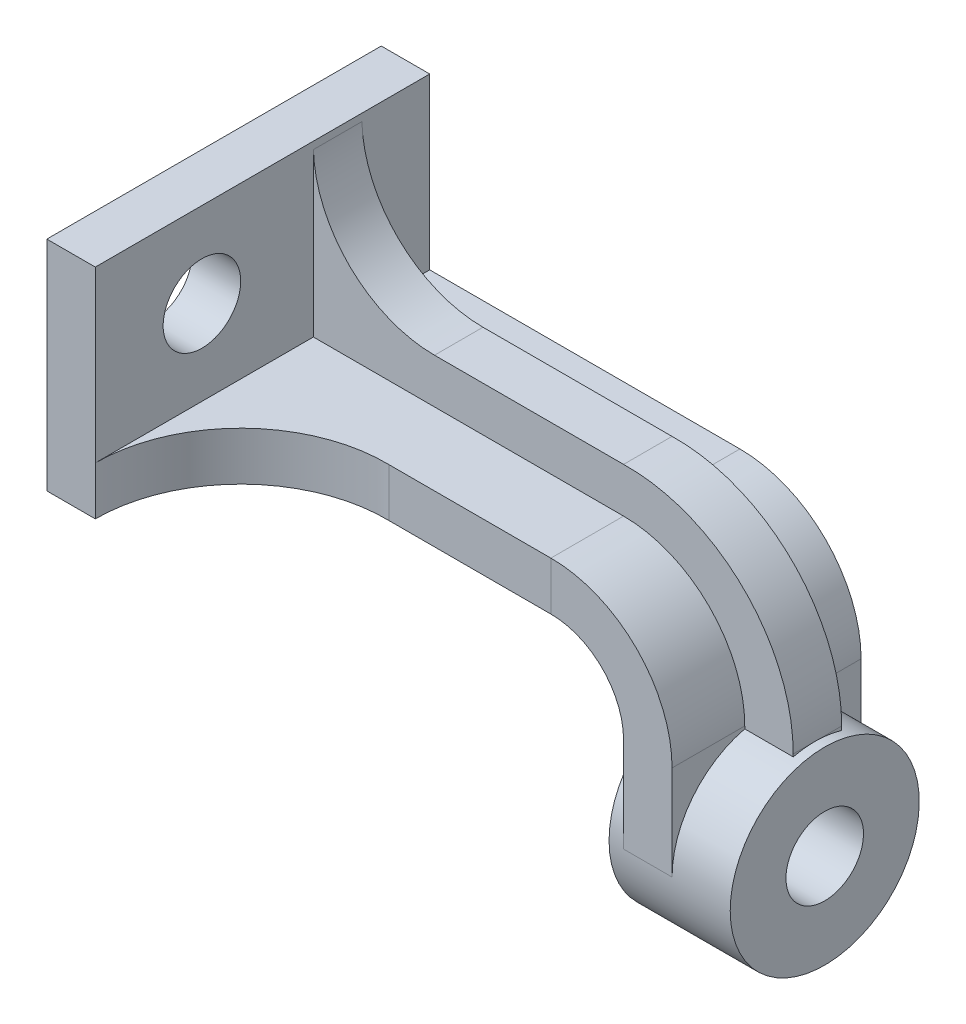
ISO-10303-21;
HEADER;
FILE_DESCRIPTION(('STEP AP214'),'2;1');
FILE_NAME('part.step','',(''),(''),'','','');
FILE_SCHEMA(('AUTOMOTIVE_DESIGN { 1 0 10303 214 1 1 1 1 }'));
ENDSEC;
DATA;
#1=APPLICATION_CONTEXT('core data for automotive mechanical design processes');
#2=APPLICATION_PROTOCOL_DEFINITION('international standard','automotive_design',2000,#1);
#3=PRODUCT_CONTEXT('',#1,'mechanical');
#4=PRODUCT('Part','Part','',(#3));
#5=PRODUCT_RELATED_PRODUCT_CATEGORY('part','',(#4));
#6=PRODUCT_DEFINITION_FORMATION('','',#4);
#7=PRODUCT_DEFINITION_CONTEXT('part definition',#1,'design');
#8=PRODUCT_DEFINITION('design','',#6,#7);
#9=PRODUCT_DEFINITION_SHAPE('','',#8);
#10=(LENGTH_UNIT() NAMED_UNIT(*) SI_UNIT(.MILLI.,.METRE.));
#11=(NAMED_UNIT(*) PLANE_ANGLE_UNIT() SI_UNIT($,.RADIAN.));
#12=(NAMED_UNIT(*) SI_UNIT($,.STERADIAN.) SOLID_ANGLE_UNIT());
#13=UNCERTAINTY_MEASURE_WITH_UNIT(LENGTH_MEASURE(1.E-05),#10,'distance_accuracy_value','');
#14=(GEOMETRIC_REPRESENTATION_CONTEXT(3) GLOBAL_UNCERTAINTY_ASSIGNED_CONTEXT((#13)) GLOBAL_UNIT_ASSIGNED_CONTEXT((#10,
#11,#12)) REPRESENTATION_CONTEXT('',''));
#15=CARTESIAN_POINT('',(0.,0.,0.));
#16=DIRECTION('',(0.,0.,1.));
#17=DIRECTION('',(1.,0.,0.));
#18=AXIS2_PLACEMENT_3D('',#15,#16,#17);
#19=CARTESIAN_POINT('',(89.,0.,-43.3456539052805));
#20=DIRECTION('',(-1.,0.,0.));
#21=DIRECTION('',(0.,-1.,0.));
#22=AXIS2_PLACEMENT_3D('',#19,#20,#21);
#23=PLANE('',#22);
#24=DIRECTION('',(0.,-1.,0.));
#25=VECTOR('',#24,1.);
#26=CARTESIAN_POINT('',(89.,0.,-19.3456539052805));
#27=LINE('',#26,#25);
#28=CARTESIAN_POINT('',(89.,-15.,-19.3456539052805));
#29=VERTEX_POINT('',#28);
#30=CARTESIAN_POINT('',(89.,-15.5263340389897,-19.3456539052805));
#31=VERTEX_POINT('',#30);
#32=EDGE_CURVE('E64',#29,#31,#27,.T.);
#33=ORIENTED_EDGE('',*,*,#32,.F.);
#34=DIRECTION('',(0.,0.,1.));
#35=VECTOR('',#34,1.);
#36=CARTESIAN_POINT('',(89.,-15.,-43.3456539052805));
#37=LINE('',#36,#35);
#38=CARTESIAN_POINT('',(89.,-15.,-4.3456539052805));
#39=VERTEX_POINT('',#38);
#40=EDGE_CURVE('E345',#29,#39,#37,.T.);
#41=ORIENTED_EDGE('',*,*,#40,.T.);
#42=DIRECTION('',(0.,1.,0.));
#43=VECTOR('',#42,1.);
#44=CARTESIAN_POINT('',(89.,0.,-4.3456539052805));
#45=LINE('',#44,#43);
#46=CARTESIAN_POINT('',(89.,-34.5,-4.3456539052805));
#47=VERTEX_POINT('',#46);
#48=EDGE_CURVE('E286',#47,#39,#45,.T.);
#49=ORIENTED_EDGE('',*,*,#48,.F.);
#50=CARTESIAN_POINT('',(89.,-34.5,-23.8456539052805));
#51=DIRECTION('',(1.,0.,0.));
#52=DIRECTION('',(0.,1.,0.));
#53=AXIS2_PLACEMENT_3D('',#50,#51,#52);
#54=CIRCLE('',#53,19.5);
#55=EDGE_CURVE('E279',#31,#47,#54,.T.);
#56=ORIENTED_EDGE('',*,*,#55,.F.);
#57=EDGE_LOOP('',(#33,#41,#49,#56));
#58=FACE_BOUND('',#57,.T.);
#59=ADVANCED_FACE('F41',(#58),#23,.F.);
#60=CARTESIAN_POINT('',(64.,-15.,-43.3456539052805));
#61=DIRECTION('',(0.,0.,1.));
#62=DIRECTION('',(1.,0.,0.));
#63=AXIS2_PLACEMENT_3D('',#60,#61,#62);
#64=CYLINDRICAL_SURFACE('',#63,25.);
#65=ORIENTED_EDGE('',*,*,#40,.F.);
#66=CARTESIAN_POINT('',(63.9999999999998,-15.0000000000002,-19.3456539052805));
#67=DIRECTION('',(0.,0.,-1.));
#68=DIRECTION('',(-1.,0.,0.));
#69=AXIS2_PLACEMENT_3D('',#66,#67,#68);
#70=CIRCLE('',#69,25.0000000000002);
#71=CARTESIAN_POINT('',(64.,10.,-19.3456539052805));
#72=VERTEX_POINT('',#71);
#73=EDGE_CURVE('E251',#29,#72,#70,.F.);
#74=ORIENTED_EDGE('',*,*,#73,.T.);
#75=DIRECTION('',(0.,0.,1.));
#76=VECTOR('',#75,1.);
#77=CARTESIAN_POINT('',(64.,10.,-43.3456539052805));
#78=LINE('',#77,#76);
#79=CARTESIAN_POINT('',(64.,9.99999999999999,-4.3456539052805));
#80=VERTEX_POINT('',#79);
#81=EDGE_CURVE('E342',#72,#80,#78,.T.);
#82=ORIENTED_EDGE('',*,*,#81,.T.);
#83=CARTESIAN_POINT('',(64.,-15.,-4.3456539052805));
#84=DIRECTION('',(0.,0.,1.));
#85=DIRECTION('',(1.,0.,0.));
#86=AXIS2_PLACEMENT_3D('',#83,#84,#85);
#87=CIRCLE('',#86,25.);
#88=EDGE_CURVE('E289',#39,#80,#87,.T.);
#89=ORIENTED_EDGE('',*,*,#88,.F.);
#90=EDGE_LOOP('',(#65,#74,#82,#89));
#91=FACE_BOUND('',#90,.T.);
#92=ADVANCED_FACE('F415',(#91),#64,.T.);
#93=CARTESIAN_POINT('',(0.,10.,-43.3456539052805));
#94=DIRECTION('',(0.,-1.,0.));
#95=DIRECTION('',(0.,0.,-1.));
#96=AXIS2_PLACEMENT_3D('',#93,#94,#95);
#97=PLANE('',#96);
#98=DIRECTION('',(1.,0.,0.));
#99=VECTOR('',#98,1.);
#100=CARTESIAN_POINT('',(0.,10.,-19.3456539052805));
#101=LINE('',#100,#99);
#102=CARTESIAN_POINT('',(0.,10.,-19.3456539052805));
#103=VERTEX_POINT('',#102);
#104=EDGE_CURVE('E224',#103,#72,#101,.T.);
#105=ORIENTED_EDGE('',*,*,#104,.F.);
#106=DIRECTION('',(0.,0.,1.));
#107=VECTOR('',#106,1.);
#108=CARTESIAN_POINT('',(0.,10.,-43.3456539052805));
#109=LINE('',#108,#107);
#110=CARTESIAN_POINT('',(0.,10.,25.6543460947195));
#111=VERTEX_POINT('',#110);
#112=EDGE_CURVE('E339',#103,#111,#109,.T.);
#113=ORIENTED_EDGE('',*,*,#112,.T.);
#114=CARTESIAN_POINT('',(30.,10.,25.6543460947195));
#115=DIRECTION('',(0.,1.,0.));
#116=DIRECTION('',(0.,0.,1.));
#117=AXIS2_PLACEMENT_3D('',#114,#115,#116);
#118=CIRCLE('',#117,30.);
#119=CARTESIAN_POINT('',(30.6435797885327,10.,-4.33874986178012));
#120=VERTEX_POINT('',#119);
#121=EDGE_CURVE('E299',#111,#120,#118,.F.);
#122=ORIENTED_EDGE('',*,*,#121,.T.);
#123=DIRECTION('',(1.,0.,0.));
#124=VECTOR('',#123,1.);
#125=CARTESIAN_POINT('',(0.,10.,-4.33874986178012));
#126=LINE('',#125,#124);
#127=CARTESIAN_POINT('',(64.,10.,-4.33874986178012));
#128=VERTEX_POINT('',#127);
#129=EDGE_CURVE('E303',#120,#128,#126,.T.);
#130=ORIENTED_EDGE('',*,*,#129,.T.);
#131=DIRECTION('',(0.,0.,1.));
#132=VECTOR('',#131,1.);
#133=CARTESIAN_POINT('',(64.,9.99999999999999,-4.3456539052805));
#134=LINE('',#133,#132);
#135=EDGE_CURVE('E295',#80,#128,#134,.T.);
#136=ORIENTED_EDGE('',*,*,#135,.F.);
#137=ORIENTED_EDGE('',*,*,#81,.F.);
#138=EDGE_LOOP('',(#105,#113,#122,#130,#136,#137));
#139=FACE_BOUND('',#138,.T.);
#140=ADVANCED_FACE('F419',(#139),#97,.F.);
#141=CARTESIAN_POINT('',(79.,0.,-43.3456539052805));
#142=DIRECTION('',(-1.,0.,0.));
#143=DIRECTION('',(0.,0.,1.));
#144=AXIS2_PLACEMENT_3D('',#141,#142,#143);
#145=PLANE('',#144);
#146=DIRECTION('',(0.,-1.,0.));
#147=VECTOR('',#146,1.);
#148=CARTESIAN_POINT('',(79.,0.,-43.3456539052805));
#149=LINE('',#148,#147);
#150=CARTESIAN_POINT('',(79.,-15.,-43.3456539052805));
#151=VERTEX_POINT('',#150);
#152=CARTESIAN_POINT('',(79.,-34.5,-43.3456539052805));
#153=VERTEX_POINT('',#152);
#154=EDGE_CURVE('E323',#151,#153,#149,.T.);
#155=ORIENTED_EDGE('',*,*,#154,.T.);
#156=CARTESIAN_POINT('',(79.,-34.5,-23.8456539052805));
#157=DIRECTION('',(-1.,0.,0.));
#158=DIRECTION('',(0.,0.,1.));
#159=AXIS2_PLACEMENT_3D('',#156,#157,#158);
#160=CIRCLE('',#159,19.5);
#161=CARTESIAN_POINT('',(79.,-15.0000000000001,-23.8456539052805));
#162=VERTEX_POINT('',#161);
#163=EDGE_CURVE('E266',#162,#153,#160,.T.);
#164=ORIENTED_EDGE('',*,*,#163,.F.);
#165=DIRECTION('',(0.,0.,1.));
#166=VECTOR('',#165,1.);
#167=CARTESIAN_POINT('',(79.,-15.,-43.3456539052805));
#168=LINE('',#167,#166);
#169=EDGE_CURVE('E346',#151,#162,#168,.T.);
#170=ORIENTED_EDGE('',*,*,#169,.F.);
#171=EDGE_LOOP('',(#155,#164,#170));
#172=FACE_BOUND('',#171,.T.);
#173=ADVANCED_FACE('F456',(#172),#145,.T.);
#174=CARTESIAN_POINT('',(-10.,0.,-43.3456539052805));
#175=DIRECTION('',(0.,0.,-1.));
#176=DIRECTION('',(-1.,0.,0.));
#177=AXIS2_PLACEMENT_3D('',#174,#175,#176);
#178=PLANE('',#177);
#179=DIRECTION('',(0.,-1.,0.));
#180=VECTOR('',#179,1.);
#181=CARTESIAN_POINT('',(89.,0.,-43.3456539052805));
#182=LINE('',#181,#180);
#183=CARTESIAN_POINT('',(89.,-15.,-43.3456539052805));
#184=VERTEX_POINT('',#183);
#185=CARTESIAN_POINT('',(89.,-34.5,-43.3456539052805));
#186=VERTEX_POINT('',#185);
#187=EDGE_CURVE('E326',#184,#186,#182,.T.);
#188=ORIENTED_EDGE('',*,*,#187,.T.);
#189=DIRECTION('',(1.,0.,0.));
#190=VECTOR('',#189,1.);
#191=CARTESIAN_POINT('',(77.,-34.5,-43.3456539052805));
#192=LINE('',#191,#190);
#193=EDGE_CURVE('E270',#153,#186,#192,.T.);
#194=ORIENTED_EDGE('',*,*,#193,.F.);
#195=ORIENTED_EDGE('',*,*,#154,.F.);
#196=CARTESIAN_POINT('',(63.9999999999999,-15.0000000000001,-43.3456539052805));
#197=DIRECTION('',(0.,0.,1.));
#198=DIRECTION('',(1.,0.,0.));
#199=AXIS2_PLACEMENT_3D('',#196,#197,#198);
#200=CIRCLE('',#199,15.0000000000001);
#201=CARTESIAN_POINT('',(63.9999999999999,0.,-43.3456539052805));
#202=VERTEX_POINT('',#201);
#203=EDGE_CURVE('E320',#202,#151,#200,.F.);
#204=ORIENTED_EDGE('',*,*,#203,.F.);
#205=DIRECTION('',(1.,0.,0.));
#206=VECTOR('',#205,1.);
#207=CARTESIAN_POINT('',(-10.,0.,-43.3456539052805));
#208=LINE('',#207,#206);
#209=CARTESIAN_POINT('',(-10.,0.,-43.3456539052805));
#210=VERTEX_POINT('',#209);
#211=EDGE_CURVE('E378',#210,#202,#208,.T.);
#212=ORIENTED_EDGE('',*,*,#211,.F.);
#213=DIRECTION('',(0.,1.,0.));
#214=VECTOR('',#213,1.);
#215=CARTESIAN_POINT('',(-10.,0.,-43.3456539052805));
#216=LINE('',#215,#214);
#217=CARTESIAN_POINT('',(-10.,45.,-43.3456539052805));
#218=VERTEX_POINT('',#217);
#219=EDGE_CURVE('E359',#210,#218,#216,.T.);
#220=ORIENTED_EDGE('',*,*,#219,.T.);
#221=DIRECTION('',(1.,0.,0.));
#222=VECTOR('',#221,1.);
#223=CARTESIAN_POINT('',(-10.,45.,-43.3456539052805));
#224=LINE('',#223,#222);
#225=CARTESIAN_POINT('',(0.,45.,-43.3456539052805));
#226=VERTEX_POINT('',#225);
#227=EDGE_CURVE('E375',#218,#226,#224,.T.);
#228=ORIENTED_EDGE('',*,*,#227,.T.);
#229=DIRECTION('',(0.,1.,0.));
#230=VECTOR('',#229,1.);
#231=CARTESIAN_POINT('',(0.,0.,-43.3456539052805));
#232=LINE('',#231,#230);
#233=CARTESIAN_POINT('',(0.,10.,-43.3456539052805));
#234=VERTEX_POINT('',#233);
#235=EDGE_CURVE('E368',#234,#226,#232,.T.);
#236=ORIENTED_EDGE('',*,*,#235,.F.);
#237=DIRECTION('',(1.,0.,0.));
#238=VECTOR('',#237,1.);
#239=CARTESIAN_POINT('',(0.,10.,-43.3456539052805));
#240=LINE('',#239,#238);
#241=CARTESIAN_POINT('',(64.,10.,-43.3456539052805));
#242=VERTEX_POINT('',#241);
#243=EDGE_CURVE('E332',#234,#242,#240,.T.);
#244=ORIENTED_EDGE('',*,*,#243,.T.);
#245=CARTESIAN_POINT('',(64.,-15.,-43.3456539052805));
#246=DIRECTION('',(0.,0.,1.));
#247=DIRECTION('',(1.,0.,0.));
#248=AXIS2_PLACEMENT_3D('',#245,#246,#247);
#249=CIRCLE('',#248,25.);
#250=EDGE_CURVE('E329',#184,#242,#249,.T.);
#251=ORIENTED_EDGE('',*,*,#250,.F.);
#252=EDGE_LOOP('',(#188,#194,#195,#204,#212,#220,#228,#236,#244,#251));
#253=FACE_BOUND('',#252,.T.);
#254=ADVANCED_FACE('F440',(#253),#178,.T.);
#255=CARTESIAN_POINT('',(89.,-15.,-29.3456539052805));
#256=VERTEX_POINT('',#255);
#257=EDGE_CURVE('E343',#184,#256,#37,.T.);
#258=ORIENTED_EDGE('',*,*,#257,.T.);
#259=DIRECTION('',(0.,-1.,0.));
#260=VECTOR('',#259,1.);
#261=CARTESIAN_POINT('',(89.,0.,-29.3456539052805));
#262=LINE('',#261,#260);
#263=CARTESIAN_POINT('',(89.,-15.7917130661303,-29.3456539052805));
#264=VERTEX_POINT('',#263);
#265=EDGE_CURVE('E233',#256,#264,#262,.T.);
#266=ORIENTED_EDGE('',*,*,#265,.T.);
#267=EDGE_CURVE('E274',#186,#264,#54,.T.);
#268=ORIENTED_EDGE('',*,*,#267,.F.);
#269=ORIENTED_EDGE('',*,*,#187,.F.);
#270=EDGE_LOOP('',(#258,#266,#268,#269));
#271=FACE_BOUND('',#270,.T.);
#272=ADVANCED_FACE('F461',(#271),#23,.F.);
#273=CARTESIAN_POINT('',(63.9999999999998,-15.0000000000002,-29.3456539052805));
#274=DIRECTION('',(0.,0.,-1.));
#275=DIRECTION('',(-1.,0.,0.));
#276=AXIS2_PLACEMENT_3D('',#273,#274,#275);
#277=CIRCLE('',#276,25.0000000000002);
#278=CARTESIAN_POINT('',(64.,10.,-29.3456539052805));
#279=VERTEX_POINT('',#278);
#280=EDGE_CURVE('E56',#256,#279,#277,.F.);
#281=ORIENTED_EDGE('',*,*,#280,.F.);
#282=ORIENTED_EDGE('',*,*,#257,.F.);
#283=ORIENTED_EDGE('',*,*,#250,.T.);
#284=EDGE_CURVE('E340',#242,#279,#78,.T.);
#285=ORIENTED_EDGE('',*,*,#284,.T.);
#286=EDGE_LOOP('',(#281,#282,#283,#285));
#287=FACE_BOUND('',#286,.T.);
#288=ADVANCED_FACE('F466',(#287),#64,.T.);
#289=CARTESIAN_POINT('',(79.,-15.,-4.3456539052805));
#290=VERTEX_POINT('',#289);
#291=EDGE_CURVE('E349',#162,#290,#168,.T.);
#292=ORIENTED_EDGE('',*,*,#291,.F.);
#293=CARTESIAN_POINT('',(79.,-34.5,-4.3456539052805));
#294=VERTEX_POINT('',#293);
#295=EDGE_CURVE('E271',#294,#162,#160,.T.);
#296=ORIENTED_EDGE('',*,*,#295,.F.);
#297=DIRECTION('',(0.,-1.,0.));
#298=VECTOR('',#297,1.);
#299=CARTESIAN_POINT('',(79.,0.,-4.3456539052805));
#300=LINE('',#299,#298);
#301=EDGE_CURVE('E283',#290,#294,#300,.T.);
#302=ORIENTED_EDGE('',*,*,#301,.F.);
#303=EDGE_LOOP('',(#292,#296,#302));
#304=FACE_BOUND('',#303,.T.);
#305=ADVANCED_FACE('F452',(#304),#145,.T.);
#306=CARTESIAN_POINT('',(63.9999999999999,-15.0000000000001,-43.3456539052805));
#307=DIRECTION('',(0.,0.,1.));
#308=DIRECTION('',(1.,0.,0.));
#309=AXIS2_PLACEMENT_3D('',#306,#307,#308);
#310=CYLINDRICAL_SURFACE('',#309,15.0000000000001);
#311=ORIENTED_EDGE('',*,*,#169,.T.);
#312=ORIENTED_EDGE('',*,*,#291,.T.);
#313=CARTESIAN_POINT('',(63.9999999999999,-15.0000000000001,-4.3456539052805));
#314=DIRECTION('',(0.,0.,1.));
#315=DIRECTION('',(1.,0.,0.));
#316=AXIS2_PLACEMENT_3D('',#313,#314,#315);
#317=CIRCLE('',#316,15.0000000000001);
#318=CARTESIAN_POINT('',(64.,0.,-4.3456539052805));
#319=VERTEX_POINT('',#318);
#320=EDGE_CURVE('E278',#319,#290,#317,.F.);
#321=ORIENTED_EDGE('',*,*,#320,.F.);
#322=DIRECTION('',(0.,0.,1.));
#323=VECTOR('',#322,1.);
#324=CARTESIAN_POINT('',(63.9999999999999,0.,-43.3456539052805));
#325=LINE('',#324,#323);
#326=EDGE_CURVE('E334',#202,#319,#325,.T.);
#327=ORIENTED_EDGE('',*,*,#326,.F.);
#328=ORIENTED_EDGE('',*,*,#203,.T.);
#329=EDGE_LOOP('',(#311,#312,#321,#327,#328));
#330=FACE_BOUND('',#329,.T.);
#331=ADVANCED_FACE('F448',(#330),#310,.F.);
#332=CARTESIAN_POINT('',(-10.,45.,25.6543460947195));
#333=DIRECTION('',(0.,0.,1.));
#334=DIRECTION('',(0.,-1.,0.));
#335=AXIS2_PLACEMENT_3D('',#332,#333,#334);
#336=PLANE('',#335);
#337=DIRECTION('',(1.,0.,0.));
#338=VECTOR('',#337,1.);
#339=CARTESIAN_POINT('',(-10.,0.,25.6543460947195));
#340=LINE('',#339,#338);
#341=CARTESIAN_POINT('',(-10.,0.,25.6543460947195));
#342=VERTEX_POINT('',#341);
#343=CARTESIAN_POINT('',(0.,0.,25.6543460947195));
#344=VERTEX_POINT('',#343);
#345=EDGE_CURVE('E365',#342,#344,#340,.T.);
#346=ORIENTED_EDGE('',*,*,#345,.T.);
#347=DIRECTION('',(0.,1.,0.));
#348=VECTOR('',#347,1.);
#349=CARTESIAN_POINT('',(0.,-59.,25.6543460947195));
#350=LINE('',#349,#348);
#351=EDGE_CURVE('E306',#344,#111,#350,.T.);
#352=ORIENTED_EDGE('',*,*,#351,.T.);
#353=DIRECTION('',(0.,-1.,0.));
#354=VECTOR('',#353,1.);
#355=CARTESIAN_POINT('',(0.,45.,25.6543460947195));
#356=LINE('',#355,#354);
#357=CARTESIAN_POINT('',(0.,45.,25.6543460947195));
#358=VERTEX_POINT('',#357);
#359=EDGE_CURVE('E338',#358,#111,#356,.T.);
#360=ORIENTED_EDGE('',*,*,#359,.F.);
#361=DIRECTION('',(1.,0.,0.));
#362=VECTOR('',#361,1.);
#363=CARTESIAN_POINT('',(-10.,45.,25.6543460947195));
#364=LINE('',#363,#362);
#365=CARTESIAN_POINT('',(-10.,45.,25.6543460947195));
#366=VERTEX_POINT('',#365);
#367=EDGE_CURVE('E372',#366,#358,#364,.T.);
#368=ORIENTED_EDGE('',*,*,#367,.F.);
#369=DIRECTION('',(0.,-1.,0.));
#370=VECTOR('',#369,1.);
#371=CARTESIAN_POINT('',(-10.,45.,25.6543460947195));
#372=LINE('',#371,#370);
#373=EDGE_CURVE('E352',#366,#342,#372,.T.);
#374=ORIENTED_EDGE('',*,*,#373,.T.);
#375=EDGE_LOOP('',(#346,#352,#360,#368,#374));
#376=FACE_BOUND('',#375,.T.);
#377=ADVANCED_FACE('F43',(#376),#336,.T.);
#378=CARTESIAN_POINT('',(-10.,0.,25.6543460947195));
#379=DIRECTION('',(0.,-1.,0.));
#380=DIRECTION('',(0.,0.,-1.));
#381=AXIS2_PLACEMENT_3D('',#378,#379,#380);
#382=PLANE('',#381);
#383=DIRECTION('',(-1.,0.,0.));
#384=VECTOR('',#383,1.);
#385=CARTESIAN_POINT('',(-10.,0.,-4.33874986178012));
#386=LINE('',#385,#384);
#387=CARTESIAN_POINT('',(64.,0.,-4.33874986178012));
#388=VERTEX_POINT('',#387);
#389=CARTESIAN_POINT('',(30.6435797885327,0.,-4.33874986178012));
#390=VERTEX_POINT('',#389);
#391=EDGE_CURVE('E309',#388,#390,#386,.T.);
#392=ORIENTED_EDGE('',*,*,#391,.T.);
#393=CARTESIAN_POINT('',(30.,0.,25.6543460947195));
#394=DIRECTION('',(0.,-1.,0.));
#395=DIRECTION('',(0.,0.,-1.));
#396=AXIS2_PLACEMENT_3D('',#393,#394,#395);
#397=CIRCLE('',#396,30.);
#398=EDGE_CURVE('E317',#390,#344,#397,.F.);
#399=ORIENTED_EDGE('',*,*,#398,.T.);
#400=ORIENTED_EDGE('',*,*,#345,.F.);
#401=DIRECTION('',(0.,0.,-1.));
#402=VECTOR('',#401,1.);
#403=CARTESIAN_POINT('',(-10.,0.,25.6543460947195));
#404=LINE('',#403,#402);
#405=EDGE_CURVE('E355',#342,#210,#404,.T.);
#406=ORIENTED_EDGE('',*,*,#405,.T.);
#407=ORIENTED_EDGE('',*,*,#211,.T.);
#408=ORIENTED_EDGE('',*,*,#326,.T.);
#409=DIRECTION('',(0.,0.,1.));
#410=VECTOR('',#409,1.);
#411=CARTESIAN_POINT('',(64.,0.,-4.3456539052805));
#412=LINE('',#411,#410);
#413=EDGE_CURVE('E296',#319,#388,#412,.T.);
#414=ORIENTED_EDGE('',*,*,#413,.T.);
#415=EDGE_LOOP('',(#392,#399,#400,#406,#407,#408,#414));
#416=FACE_BOUND('',#415,.T.);
#417=ADVANCED_FACE('F434',(#416),#382,.T.);
#418=CARTESIAN_POINT('',(0.,10.,-29.3456539052805));
#419=VERTEX_POINT('',#418);
#420=EDGE_CURVE('E335',#234,#419,#109,.T.);
#421=ORIENTED_EDGE('',*,*,#420,.T.);
#422=DIRECTION('',(1.,0.,0.));
#423=VECTOR('',#422,1.);
#424=CARTESIAN_POINT('',(0.,10.,-29.3456539052805));
#425=LINE('',#424,#423);
#426=EDGE_CURVE('E236',#419,#279,#425,.T.);
#427=ORIENTED_EDGE('',*,*,#426,.T.);
#428=ORIENTED_EDGE('',*,*,#284,.F.);
#429=ORIENTED_EDGE('',*,*,#243,.F.);
#430=EDGE_LOOP('',(#421,#427,#428,#429));
#431=FACE_BOUND('',#430,.T.);
#432=ADVANCED_FACE('F464',(#431),#97,.F.);
#433=CARTESIAN_POINT('',(-10.,45.,-43.3456539052805));
#434=DIRECTION('',(0.,1.,0.));
#435=DIRECTION('',(0.,0.,1.));
#436=AXIS2_PLACEMENT_3D('',#433,#434,#435);
#437=PLANE('',#436);
#438=DIRECTION('',(0.,0.,1.));
#439=VECTOR('',#438,1.);
#440=CARTESIAN_POINT('',(0.,45.,-43.3456539052805));
#441=LINE('',#440,#439);
#442=EDGE_CURVE('E356',#226,#358,#441,.T.);
#443=ORIENTED_EDGE('',*,*,#442,.F.);
#444=ORIENTED_EDGE('',*,*,#227,.F.);
#445=DIRECTION('',(0.,0.,1.));
#446=VECTOR('',#445,1.);
#447=CARTESIAN_POINT('',(-10.,45.,-43.3456539052805));
#448=LINE('',#447,#446);
#449=EDGE_CURVE('E362',#218,#366,#448,.T.);
#450=ORIENTED_EDGE('',*,*,#449,.T.);
#451=ORIENTED_EDGE('',*,*,#367,.T.);
#452=EDGE_LOOP('',(#443,#444,#450,#451));
#453=FACE_BOUND('',#452,.T.);
#454=ADVANCED_FACE('F468',(#453),#437,.T.);
#455=CARTESIAN_POINT('',(-10.,0.,0.));
#456=DIRECTION('',(1.,0.,0.));
#457=DIRECTION('',(0.,0.,-1.));
#458=AXIS2_PLACEMENT_3D('',#455,#456,#457);
#459=PLANE('',#458);
#460=CARTESIAN_POINT('',(-10.,27.5,3.65434609471948));
#461=DIRECTION('',(1.,0.,0.));
#462=DIRECTION('',(0.,0.,-1.));
#463=AXIS2_PLACEMENT_3D('',#460,#461,#462);
#464=CIRCLE('',#463,8.);
#465=CARTESIAN_POINT('',(-10.,27.5,-4.34565390528052));
#466=VERTEX_POINT('',#465);
#467=EDGE_CURVE('E263',#466,#466,#464,.F.);
#468=ORIENTED_EDGE('',*,*,#467,.F.);
#469=EDGE_LOOP('',(#468));
#470=FACE_BOUND('',#469,.T.);
#471=ORIENTED_EDGE('',*,*,#373,.F.);
#472=ORIENTED_EDGE('',*,*,#449,.F.);
#473=ORIENTED_EDGE('',*,*,#219,.F.);
#474=ORIENTED_EDGE('',*,*,#405,.F.);
#475=EDGE_LOOP('',(#471,#472,#473,#474));
#476=FACE_BOUND('',#475,.T.);
#477=ADVANCED_FACE('F437',(#470,#476),#459,.F.);
#478=CARTESIAN_POINT('',(0.,0.,0.));
#479=DIRECTION('',(1.,0.,0.));
#480=DIRECTION('',(0.,0.,-1.));
#481=AXIS2_PLACEMENT_3D('',#478,#479,#480);
#482=PLANE('',#481);
#483=DIRECTION('',(0.,-1.,0.));
#484=VECTOR('',#483,1.);
#485=CARTESIAN_POINT('',(0.,0.,-29.3456539052805));
#486=LINE('',#485,#484);
#487=CARTESIAN_POINT('',(0.,43.4875069864588,-29.3456539052805));
#488=VERTEX_POINT('',#487);
#489=EDGE_CURVE('E220',#488,#419,#486,.T.);
#490=ORIENTED_EDGE('',*,*,#489,.T.);
#491=ORIENTED_EDGE('',*,*,#420,.F.);
#492=ORIENTED_EDGE('',*,*,#235,.T.);
#493=ORIENTED_EDGE('',*,*,#442,.T.);
#494=ORIENTED_EDGE('',*,*,#359,.T.);
#495=ORIENTED_EDGE('',*,*,#112,.F.);
#496=DIRECTION('',(0.,-1.,0.));
#497=VECTOR('',#496,1.);
#498=CARTESIAN_POINT('',(0.,0.,-19.3456539052805));
#499=LINE('',#498,#497);
#500=CARTESIAN_POINT('',(0.,43.4875069864588,-19.3456539052805));
#501=VERTEX_POINT('',#500);
#502=EDGE_CURVE('E221',#501,#103,#499,.T.);
#503=ORIENTED_EDGE('',*,*,#502,.F.);
#504=DIRECTION('',(0.,0.,1.));
#505=VECTOR('',#504,1.);
#506=CARTESIAN_POINT('',(0.,43.4875069864588,-29.3456539052805));
#507=LINE('',#506,#505);
#508=EDGE_CURVE('E239',#488,#501,#507,.T.);
#509=ORIENTED_EDGE('',*,*,#508,.F.);
#510=EDGE_LOOP('',(#490,#491,#492,#493,#494,#495,#503,#509));
#511=FACE_BOUND('',#510,.T.);
#512=CARTESIAN_POINT('',(0.,27.5,3.65434609471948));
#513=DIRECTION('',(1.,0.,0.));
#514=DIRECTION('',(0.,0.,-1.));
#515=AXIS2_PLACEMENT_3D('',#512,#513,#514);
#516=CIRCLE('',#515,8.);
#517=CARTESIAN_POINT('',(0.,27.5,-4.34565390528052));
#518=VERTEX_POINT('',#517);
#519=EDGE_CURVE('E206',#518,#518,#516,.T.);
#520=ORIENTED_EDGE('',*,*,#519,.F.);
#521=EDGE_LOOP('',(#520));
#522=FACE_BOUND('',#521,.T.);
#523=ADVANCED_FACE('F422',(#511,#522),#482,.T.);
#524=CARTESIAN_POINT('',(30.,-59.,25.6543460947195));
#525=DIRECTION('',(0.,1.,0.));
#526=DIRECTION('',(0.,0.,1.));
#527=AXIS2_PLACEMENT_3D('',#524,#525,#526);
#528=CYLINDRICAL_SURFACE('',#527,30.);
#529=DIRECTION('',(0.,1.,0.));
#530=VECTOR('',#529,1.);
#531=CARTESIAN_POINT('',(30.6435797885327,-59.,-4.33874986178012));
#532=LINE('',#531,#530);
#533=EDGE_CURVE('E307',#390,#120,#532,.T.);
#534=ORIENTED_EDGE('',*,*,#533,.T.);
#535=ORIENTED_EDGE('',*,*,#121,.F.);
#536=ORIENTED_EDGE('',*,*,#351,.F.);
#537=ORIENTED_EDGE('',*,*,#398,.F.);
#538=EDGE_LOOP('',(#534,#535,#536,#537));
#539=FACE_BOUND('',#538,.T.);
#540=ADVANCED_FACE('F427',(#539),#528,.F.);
#541=CARTESIAN_POINT('',(0.,-59.,-4.33874986178012));
#542=DIRECTION('',(0.,0.,1.));
#543=DIRECTION('',(1.,0.,0.));
#544=AXIS2_PLACEMENT_3D('',#541,#542,#543);
#545=PLANE('',#544);
#546=DIRECTION('',(0.,1.,0.));
#547=VECTOR('',#546,1.);
#548=CARTESIAN_POINT('',(64.,-59.,-4.33874986178012));
#549=LINE('',#548,#547);
#550=EDGE_CURVE('E310',#388,#128,#549,.T.);
#551=ORIENTED_EDGE('',*,*,#550,.T.);
#552=ORIENTED_EDGE('',*,*,#129,.F.);
#553=ORIENTED_EDGE('',*,*,#533,.F.);
#554=ORIENTED_EDGE('',*,*,#391,.F.);
#555=EDGE_LOOP('',(#551,#552,#553,#554));
#556=FACE_BOUND('',#555,.T.);
#557=ADVANCED_FACE('F510',(#556),#545,.T.);
#558=CARTESIAN_POINT('',(64.,0.,-4.3456539052805));
#559=DIRECTION('',(-1.,0.,0.));
#560=DIRECTION('',(0.,0.,1.));
#561=AXIS2_PLACEMENT_3D('',#558,#559,#560);
#562=PLANE('',#561);
#563=ORIENTED_EDGE('',*,*,#550,.F.);
#564=ORIENTED_EDGE('',*,*,#413,.F.);
#565=DIRECTION('',(0.,-1.,0.));
#566=VECTOR('',#565,1.);
#567=CARTESIAN_POINT('',(64.,0.,-4.3456539052805));
#568=LINE('',#567,#566);
#569=EDGE_CURVE('E292',#80,#319,#568,.T.);
#570=ORIENTED_EDGE('',*,*,#569,.F.);
#571=ORIENTED_EDGE('',*,*,#135,.T.);
#572=EDGE_LOOP('',(#563,#564,#570,#571));
#573=FACE_BOUND('',#572,.T.);
#574=ADVANCED_FACE('F515',(#573),#562,.F.);
#575=CARTESIAN_POINT('',(0.,0.,-4.3456539052805));
#576=DIRECTION('',(0.,0.,1.));
#577=DIRECTION('',(1.,0.,0.));
#578=AXIS2_PLACEMENT_3D('',#575,#576,#577);
#579=PLANE('',#578);
#580=DIRECTION('',(1.,0.,0.));
#581=VECTOR('',#580,1.);
#582=CARTESIAN_POINT('',(77.,-34.5,-4.34565390528049));
#583=LINE('',#582,#581);
#584=EDGE_CURVE('E374',#47,#294,#583,.F.);
#585=ORIENTED_EDGE('',*,*,#584,.F.);
#586=ORIENTED_EDGE('',*,*,#48,.T.);
#587=ORIENTED_EDGE('',*,*,#88,.T.);
#588=ORIENTED_EDGE('',*,*,#569,.T.);
#589=ORIENTED_EDGE('',*,*,#320,.T.);
#590=ORIENTED_EDGE('',*,*,#301,.T.);
#591=EDGE_LOOP('',(#585,#586,#587,#588,#589,#590));
#592=FACE_BOUND('',#591,.T.);
#593=ADVANCED_FACE('F412',(#592),#579,.T.);
#594=CARTESIAN_POINT('',(101.,-34.5,-23.8456539052805));
#595=DIRECTION('',(-1.,0.,0.));
#596=DIRECTION('',(0.,-1.,0.));
#597=AXIS2_PLACEMENT_3D('',#594,#595,#596);
#598=CYLINDRICAL_SURFACE('',#597,19.5);
#599=CARTESIAN_POINT('',(101.,-34.5,-23.8456539052805));
#600=DIRECTION('',(1.,0.,0.));
#601=DIRECTION('',(0.,1.,0.));
#602=AXIS2_PLACEMENT_3D('',#599,#600,#601);
#603=CIRCLE('',#602,19.5);
#604=CARTESIAN_POINT('',(101.,-15.,-23.8456539052805));
#605=VERTEX_POINT('',#604);
#606=EDGE_CURVE('E275',#605,#605,#603,.T.);
#607=ORIENTED_EDGE('',*,*,#606,.F.);
#608=EDGE_LOOP('',(#607));
#609=FACE_BOUND('',#608,.T.);
#610=ORIENTED_EDGE('',*,*,#267,.T.);
#611=DIRECTION('',(-1.,0.,0.));
#612=VECTOR('',#611,1.);
#613=CARTESIAN_POINT('',(101.,-15.7917130661303,-29.3456539052805));
#614=LINE('',#613,#612);
#615=CARTESIAN_POINT('',(99.,-15.7917130661303,-29.3456539052805));
#616=VERTEX_POINT('',#615);
#617=EDGE_CURVE('E11',#264,#616,#614,.F.);
#618=ORIENTED_EDGE('',*,*,#617,.T.);
#619=CARTESIAN_POINT('',(99.,-34.5,-23.8456539052805));
#620=DIRECTION('',(1.,0.,0.));
#621=DIRECTION('',(0.,0.,-1.));
#622=AXIS2_PLACEMENT_3D('',#619,#620,#621);
#623=CIRCLE('',#622,19.5);
#624=CARTESIAN_POINT('',(99.,-15.,-23.8456539052805));
#625=VERTEX_POINT('',#624);
#626=EDGE_CURVE('E49',#616,#625,#623,.T.);
#627=ORIENTED_EDGE('',*,*,#626,.T.);
#628=CARTESIAN_POINT('',(99.,-15.5263340389897,-19.3456539052805));
#629=VERTEX_POINT('',#628);
#630=EDGE_CURVE('E386',#625,#629,#623,.T.);
#631=ORIENTED_EDGE('',*,*,#630,.T.);
#632=DIRECTION('',(-1.,0.,0.));
#633=VECTOR('',#632,1.);
#634=CARTESIAN_POINT('',(101.,-15.5263340389897,-19.3456539052805));
#635=LINE('',#634,#633);
#636=EDGE_CURVE('E384',#31,#629,#635,.F.);
#637=ORIENTED_EDGE('',*,*,#636,.F.);
#638=ORIENTED_EDGE('',*,*,#55,.T.);
#639=ORIENTED_EDGE('',*,*,#584,.T.);
#640=ORIENTED_EDGE('',*,*,#295,.T.);
#641=ORIENTED_EDGE('',*,*,#163,.T.);
#642=ORIENTED_EDGE('',*,*,#193,.T.);
#643=EDGE_LOOP('',(#610,#618,#627,#631,#637,#638,#639,#640,#641,#642));
#644=FACE_BOUND('',#643,.T.);
#645=CARTESIAN_POINT('',(76.,-34.5,-23.8456539052805));
#646=DIRECTION('',(-1.,0.,0.));
#647=DIRECTION('',(0.,0.,1.));
#648=AXIS2_PLACEMENT_3D('',#645,#646,#647);
#649=CIRCLE('',#648,19.5);
#650=CARTESIAN_POINT('',(76.,-34.5,-4.3456539052805));
#651=VERTEX_POINT('',#650);
#652=EDGE_CURVE('E267',#651,#651,#649,.T.);
#653=ORIENTED_EDGE('',*,*,#652,.F.);
#654=EDGE_LOOP('',(#653));
#655=FACE_BOUND('',#654,.T.);
#656=ADVANCED_FACE('F391',(#609,#644,#655),#598,.T.);
#657=CARTESIAN_POINT('',(101.,-34.5,-23.8456539052805));
#658=DIRECTION('',(1.,0.,0.));
#659=DIRECTION('',(0.,1.,0.));
#660=AXIS2_PLACEMENT_3D('',#657,#658,#659);
#661=PLANE('',#660);
#662=CARTESIAN_POINT('',(101.,-34.5,-23.8456539052805));
#663=DIRECTION('',(1.,0.,0.));
#664=DIRECTION('',(0.,1.,0.));
#665=AXIS2_PLACEMENT_3D('',#662,#663,#664);
#666=CIRCLE('',#665,8.);
#667=CARTESIAN_POINT('',(101.,-26.5,-23.8456539052805));
#668=VERTEX_POINT('',#667);
#669=EDGE_CURVE('E242',#668,#668,#666,.T.);
#670=ORIENTED_EDGE('',*,*,#669,.F.);
#671=EDGE_LOOP('',(#670));
#672=FACE_BOUND('',#671,.T.);
#673=ORIENTED_EDGE('',*,*,#606,.T.);
#674=EDGE_LOOP('',(#673));
#675=FACE_BOUND('',#674,.T.);
#676=ADVANCED_FACE('F526',(#672,#675),#661,.T.);
#677=CARTESIAN_POINT('',(76.,-34.5,-23.8456539052805));
#678=DIRECTION('',(-1.,0.,0.));
#679=DIRECTION('',(0.,0.,1.));
#680=AXIS2_PLACEMENT_3D('',#677,#678,#679);
#681=PLANE('',#680);
#682=CARTESIAN_POINT('',(76.,-34.5,-23.8456539052805));
#683=DIRECTION('',(-1.,0.,0.));
#684=DIRECTION('',(0.,0.,1.));
#685=AXIS2_PLACEMENT_3D('',#682,#683,#684);
#686=CIRCLE('',#685,8.);
#687=CARTESIAN_POINT('',(76.,-34.5,-15.8456539052805));
#688=VERTEX_POINT('',#687);
#689=EDGE_CURVE('E227',#688,#688,#686,.F.);
#690=ORIENTED_EDGE('',*,*,#689,.T.);
#691=EDGE_LOOP('',(#690));
#692=FACE_BOUND('',#691,.T.);
#693=ORIENTED_EDGE('',*,*,#652,.T.);
#694=EDGE_LOOP('',(#693));
#695=FACE_BOUND('',#694,.T.);
#696=ADVANCED_FACE('F530',(#692,#695),#681,.T.);
#697=CARTESIAN_POINT('',(-10.001,27.5,3.65434609471948));
#698=DIRECTION('',(1.,0.,0.));
#699=DIRECTION('',(0.,0.,-1.));
#700=AXIS2_PLACEMENT_3D('',#697,#698,#699);
#701=CYLINDRICAL_SURFACE('',#700,8.);
#702=ORIENTED_EDGE('',*,*,#519,.T.);
#703=EDGE_LOOP('',(#702));
#704=FACE_BOUND('',#703,.T.);
#705=ORIENTED_EDGE('',*,*,#467,.T.);
#706=EDGE_LOOP('',(#705));
#707=FACE_BOUND('',#706,.T.);
#708=ADVANCED_FACE('F534',(#704,#707),#701,.F.);
#709=CARTESIAN_POINT('',(99.,0.,-29.3456539052805));
#710=DIRECTION('',(1.,0.,0.));
#711=DIRECTION('',(0.,0.,-1.));
#712=AXIS2_PLACEMENT_3D('',#709,#710,#711);
#713=PLANE('',#712);
#714=ORIENTED_EDGE('',*,*,#626,.F.);
#715=DIRECTION('',(0.,1.,0.));
#716=VECTOR('',#715,1.);
#717=CARTESIAN_POINT('',(99.,0.,-29.3456539052805));
#718=LINE('',#717,#716);
#719=CARTESIAN_POINT('',(99.,-15.,-29.3456539052805));
#720=VERTEX_POINT('',#719);
#721=EDGE_CURVE('E231',#616,#720,#718,.T.);
#722=ORIENTED_EDGE('',*,*,#721,.T.);
#723=DIRECTION('',(0.,0.,1.));
#724=VECTOR('',#723,1.);
#725=CARTESIAN_POINT('',(99.,-15.,-29.3456539052805));
#726=LINE('',#725,#724);
#727=EDGE_CURVE('E257',#720,#625,#726,.T.);
#728=ORIENTED_EDGE('',*,*,#727,.T.);
#729=EDGE_LOOP('',(#714,#722,#728));
#730=FACE_BOUND('',#729,.T.);
#731=ADVANCED_FACE('F403',(#730),#713,.T.);
#732=CARTESIAN_POINT('',(0.,0.,-29.3456539052805));
#733=DIRECTION('',(0.,0.,-1.));
#734=DIRECTION('',(-1.,0.,0.));
#735=AXIS2_PLACEMENT_3D('',#732,#733,#734);
#736=PLANE('',#735);
#737=ORIENTED_EDGE('',*,*,#617,.F.);
#738=ORIENTED_EDGE('',*,*,#265,.F.);
#739=ORIENTED_EDGE('',*,*,#280,.T.);
#740=ORIENTED_EDGE('',*,*,#426,.F.);
#741=ORIENTED_EDGE('',*,*,#489,.F.);
#742=CARTESIAN_POINT('',(24.9885592065849,44.2437534932294,-29.3456539052805));
#743=DIRECTION('',(0.,0.,-1.));
#744=DIRECTION('',(-1.,0.,0.));
#745=AXIS2_PLACEMENT_3D('',#742,#743,#744);
#746=CIRCLE('',#745,25.);
#747=CARTESIAN_POINT('',(24.9885592065849,19.2437534932294,-29.3456539052805));
#748=VERTEX_POINT('',#747);
#749=EDGE_CURVE('E199',#748,#488,#746,.T.);
#750=ORIENTED_EDGE('',*,*,#749,.F.);
#751=DIRECTION('',(1.,0.,0.));
#752=VECTOR('',#751,1.);
#753=CARTESIAN_POINT('',(0.,19.2437534932294,-29.3456539052805));
#754=LINE('',#753,#752);
#755=CARTESIAN_POINT('',(64.,19.2437534932294,-29.3456539052805));
#756=VERTEX_POINT('',#755);
#757=EDGE_CURVE('E210',#748,#756,#754,.T.);
#758=ORIENTED_EDGE('',*,*,#757,.T.);
#759=CARTESIAN_POINT('',(64.7480763813563,-15.,-29.3456539052805));
#760=DIRECTION('',(0.,0.,-1.));
#761=DIRECTION('',(-1.,0.,0.));
#762=AXIS2_PLACEMENT_3D('',#759,#760,#761);
#763=CIRCLE('',#762,34.2519236186437);
#764=EDGE_CURVE('E215',#720,#756,#763,.F.);
#765=ORIENTED_EDGE('',*,*,#764,.F.);
#766=ORIENTED_EDGE('',*,*,#721,.F.);
#767=EDGE_LOOP('',(#737,#738,#739,#740,#741,#750,#758,#765,#766));
#768=FACE_BOUND('',#767,.T.);
#769=ADVANCED_FACE('F218',(#768),#736,.T.);
#770=CARTESIAN_POINT('',(0.,0.,-19.3456539052805));
#771=DIRECTION('',(0.,0.,-1.));
#772=DIRECTION('',(-1.,0.,0.));
#773=AXIS2_PLACEMENT_3D('',#770,#771,#772);
#774=PLANE('',#773);
#775=ORIENTED_EDGE('',*,*,#32,.T.);
#776=ORIENTED_EDGE('',*,*,#636,.T.);
#777=DIRECTION('',(0.,1.,0.));
#778=VECTOR('',#777,1.);
#779=CARTESIAN_POINT('',(99.,0.,-19.3456539052805));
#780=LINE('',#779,#778);
#781=CARTESIAN_POINT('',(99.,-15.,-19.3456539052805));
#782=VERTEX_POINT('',#781);
#783=EDGE_CURVE('E247',#629,#782,#780,.T.);
#784=ORIENTED_EDGE('',*,*,#783,.T.);
#785=CARTESIAN_POINT('',(64.7480763813563,-15.,-19.3456539052805));
#786=DIRECTION('',(0.,0.,-1.));
#787=DIRECTION('',(-1.,0.,0.));
#788=AXIS2_PLACEMENT_3D('',#785,#786,#787);
#789=CIRCLE('',#788,34.2519236186437);
#790=CARTESIAN_POINT('',(64.,19.2437534932294,-19.3456539052805));
#791=VERTEX_POINT('',#790);
#792=EDGE_CURVE('E244',#782,#791,#789,.F.);
#793=ORIENTED_EDGE('',*,*,#792,.T.);
#794=DIRECTION('',(1.,0.,0.));
#795=VECTOR('',#794,1.);
#796=CARTESIAN_POINT('',(0.,19.2437534932294,-19.3456539052805));
#797=LINE('',#796,#795);
#798=CARTESIAN_POINT('',(24.9885592065849,19.2437534932294,-19.3456539052805));
#799=VERTEX_POINT('',#798);
#800=EDGE_CURVE('E241',#799,#791,#797,.T.);
#801=ORIENTED_EDGE('',*,*,#800,.F.);
#802=CARTESIAN_POINT('',(24.9885592065849,44.2437534932294,-19.3456539052805));
#803=DIRECTION('',(0.,0.,-1.));
#804=DIRECTION('',(-1.,0.,0.));
#805=AXIS2_PLACEMENT_3D('',#802,#803,#804);
#806=CIRCLE('',#805,25.);
#807=EDGE_CURVE('E202',#799,#501,#806,.T.);
#808=ORIENTED_EDGE('',*,*,#807,.T.);
#809=ORIENTED_EDGE('',*,*,#502,.T.);
#810=ORIENTED_EDGE('',*,*,#104,.T.);
#811=ORIENTED_EDGE('',*,*,#73,.F.);
#812=EDGE_LOOP('',(#775,#776,#784,#793,#801,#808,#809,#810,#811));
#813=FACE_BOUND('',#812,.T.);
#814=ADVANCED_FACE('F406',(#813),#774,.F.);
#815=CARTESIAN_POINT('',(24.9885592065849,44.2437534932294,-29.3456539052805));
#816=DIRECTION('',(0.,0.,1.));
#817=DIRECTION('',(1.,0.,0.));
#818=AXIS2_PLACEMENT_3D('',#815,#816,#817);
#819=CYLINDRICAL_SURFACE('',#818,25.);
#820=ORIENTED_EDGE('',*,*,#807,.F.);
#821=DIRECTION('',(0.,0.,1.));
#822=VECTOR('',#821,1.);
#823=CARTESIAN_POINT('',(24.9885592065849,19.2437534932294,-29.3456539052805));
#824=LINE('',#823,#822);
#825=EDGE_CURVE('E194',#748,#799,#824,.T.);
#826=ORIENTED_EDGE('',*,*,#825,.F.);
#827=ORIENTED_EDGE('',*,*,#749,.T.);
#828=ORIENTED_EDGE('',*,*,#508,.T.);
#829=EDGE_LOOP('',(#820,#826,#827,#828));
#830=FACE_BOUND('',#829,.T.);
#831=ADVANCED_FACE('F196',(#830),#819,.F.);
#832=CARTESIAN_POINT('',(0.,19.2437534932294,-29.3456539052805));
#833=DIRECTION('',(0.,-1.,0.));
#834=DIRECTION('',(1.,0.,0.));
#835=AXIS2_PLACEMENT_3D('',#832,#833,#834);
#836=PLANE('',#835);
#837=ORIENTED_EDGE('',*,*,#800,.T.);
#838=DIRECTION('',(0.,0.,1.));
#839=VECTOR('',#838,1.);
#840=CARTESIAN_POINT('',(64.,19.2437534932294,-29.3456539052805));
#841=LINE('',#840,#839);
#842=EDGE_CURVE('E207',#756,#791,#841,.T.);
#843=ORIENTED_EDGE('',*,*,#842,.F.);
#844=ORIENTED_EDGE('',*,*,#757,.F.);
#845=ORIENTED_EDGE('',*,*,#825,.T.);
#846=EDGE_LOOP('',(#837,#843,#844,#845));
#847=FACE_BOUND('',#846,.T.);
#848=ADVANCED_FACE('F211',(#847),#836,.F.);
#849=CARTESIAN_POINT('',(64.7480763813563,-15.,-29.3456539052805));
#850=DIRECTION('',(0.,0.,1.));
#851=DIRECTION('',(1.,0.,0.));
#852=AXIS2_PLACEMENT_3D('',#849,#850,#851);
#853=CYLINDRICAL_SURFACE('',#852,34.2519236186437);
#854=ORIENTED_EDGE('',*,*,#792,.F.);
#855=EDGE_CURVE('E256',#625,#782,#726,.T.);
#856=ORIENTED_EDGE('',*,*,#855,.F.);
#857=ORIENTED_EDGE('',*,*,#727,.F.);
#858=ORIENTED_EDGE('',*,*,#764,.T.);
#859=ORIENTED_EDGE('',*,*,#842,.T.);
#860=EDGE_LOOP('',(#854,#856,#857,#858,#859));
#861=FACE_BOUND('',#860,.T.);
#862=ADVANCED_FACE('F402',(#861),#853,.T.);
#863=ORIENTED_EDGE('',*,*,#630,.F.);
#864=ORIENTED_EDGE('',*,*,#855,.T.);
#865=ORIENTED_EDGE('',*,*,#783,.F.);
#866=EDGE_LOOP('',(#863,#864,#865));
#867=FACE_BOUND('',#866,.T.);
#868=ADVANCED_FACE('F398',(#867),#713,.T.);
#869=CARTESIAN_POINT('',(-10.001,-34.5,-23.8456539052805));
#870=DIRECTION('',(1.,0.,0.));
#871=DIRECTION('',(0.,1.,0.));
#872=AXIS2_PLACEMENT_3D('',#869,#870,#871);
#873=CYLINDRICAL_SURFACE('',#872,8.);
#874=ORIENTED_EDGE('',*,*,#689,.F.);
#875=EDGE_LOOP('',(#874));
#876=FACE_BOUND('',#875,.T.);
#877=ORIENTED_EDGE('',*,*,#669,.T.);
#878=EDGE_LOOP('',(#877));
#879=FACE_BOUND('',#878,.T.);
#880=ADVANCED_FACE('F547',(#876,#879),#873,.F.);
#881=CLOSED_SHELL('',(#59,#92,#140,#173,#254,#272,#288,#305,#331,#377,#417,#432,#454,#477,#523,
#540,#557,#574,#593,#656,#676,#696,#708,#731,#769,#814,#831,#848,#862,#868,#880));
#882=MANIFOLD_SOLID_BREP('B2',#881);
#883=ADVANCED_BREP_SHAPE_REPRESENTATION('',(#18,#882),#14);
#884=SHAPE_DEFINITION_REPRESENTATION(#9,#883);
ENDSEC;
END-ISO-10303-21;
